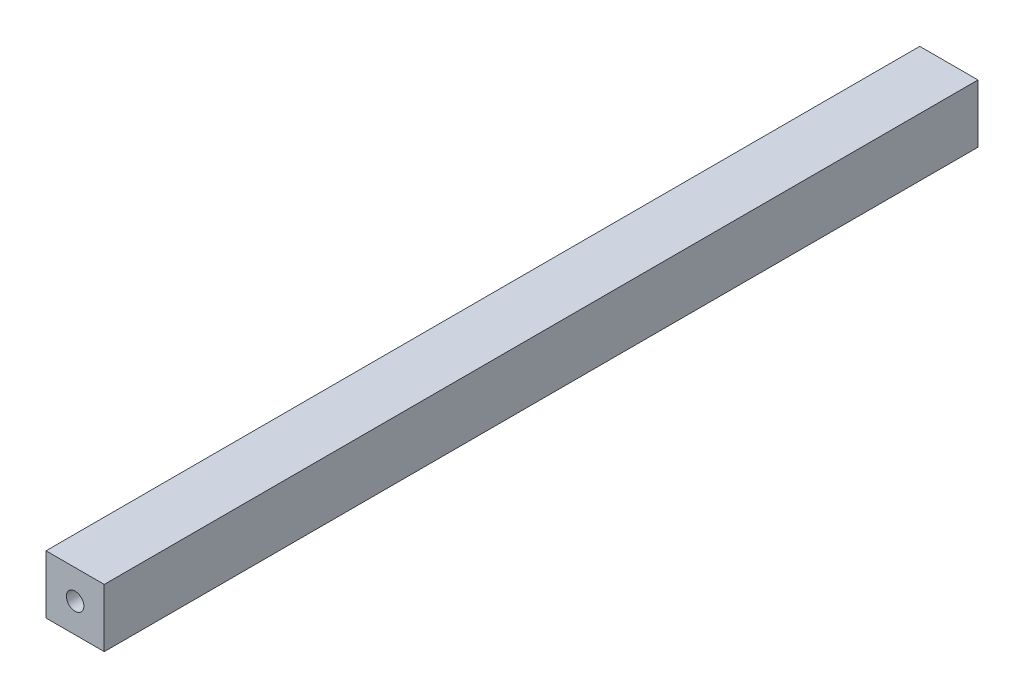
ISO-10303-21;
HEADER;
FILE_DESCRIPTION(('STEP AP214'),'2;1');
FILE_NAME('part.step','',(''),(''),'','','');
FILE_SCHEMA(('AUTOMOTIVE_DESIGN { 1 0 10303 214 1 1 1 1 }'));
ENDSEC;
DATA;
#1=APPLICATION_CONTEXT('core data for automotive mechanical design processes');
#2=APPLICATION_PROTOCOL_DEFINITION('international standard','automotive_design',2000,#1);
#3=PRODUCT_CONTEXT('',#1,'mechanical');
#4=PRODUCT('Part','Part','',(#3));
#5=PRODUCT_RELATED_PRODUCT_CATEGORY('part','',(#4));
#6=PRODUCT_DEFINITION_FORMATION('','',#4);
#7=PRODUCT_DEFINITION_CONTEXT('part definition',#1,'design');
#8=PRODUCT_DEFINITION('design','',#6,#7);
#9=PRODUCT_DEFINITION_SHAPE('','',#8);
#10=(LENGTH_UNIT() NAMED_UNIT(*) SI_UNIT(.MILLI.,.METRE.));
#11=(NAMED_UNIT(*) PLANE_ANGLE_UNIT() SI_UNIT($,.RADIAN.));
#12=(NAMED_UNIT(*) SI_UNIT($,.STERADIAN.) SOLID_ANGLE_UNIT());
#13=UNCERTAINTY_MEASURE_WITH_UNIT(LENGTH_MEASURE(1.E-05),#10,'distance_accuracy_value','');
#14=(GEOMETRIC_REPRESENTATION_CONTEXT(3) GLOBAL_UNCERTAINTY_ASSIGNED_CONTEXT((#13)) GLOBAL_UNIT_ASSIGNED_CONTEXT((#10,
#11,#12)) REPRESENTATION_CONTEXT('',''));
#15=CARTESIAN_POINT('',(0.,0.,0.));
#16=DIRECTION('',(0.,0.,1.));
#17=DIRECTION('',(1.,0.,0.));
#18=AXIS2_PLACEMENT_3D('',#15,#16,#17);
#19=CARTESIAN_POINT('',(-10.,10.,300.));
#20=DIRECTION('',(1.,0.,0.));
#21=DIRECTION('',(0.,0.,-1.));
#22=AXIS2_PLACEMENT_3D('',#19,#20,#21);
#23=PLANE('',#22);
#24=DIRECTION('',(0.,-1.,0.));
#25=VECTOR('',#24,1.);
#26=CARTESIAN_POINT('',(-10.,10.,0.));
#27=LINE('',#26,#25);
#28=CARTESIAN_POINT('',(-10.,10.,0.));
#29=VERTEX_POINT('',#28);
#30=CARTESIAN_POINT('',(-10.,-10.,0.));
#31=VERTEX_POINT('',#30);
#32=EDGE_CURVE('E106',#29,#31,#27,.T.);
#33=ORIENTED_EDGE('',*,*,#32,.T.);
#34=DIRECTION('',(0.,0.,-1.));
#35=VECTOR('',#34,1.);
#36=CARTESIAN_POINT('',(-10.,-10.,300.));
#37=LINE('',#36,#35);
#38=CARTESIAN_POINT('',(-10.,-10.,300.));
#39=VERTEX_POINT('',#38);
#40=EDGE_CURVE('E11',#39,#31,#37,.T.);
#41=ORIENTED_EDGE('',*,*,#40,.F.);
#42=DIRECTION('',(0.,-1.,0.));
#43=VECTOR('',#42,1.);
#44=CARTESIAN_POINT('',(-10.,10.,300.));
#45=LINE('',#44,#43);
#46=CARTESIAN_POINT('',(-10.,10.,300.));
#47=VERTEX_POINT('',#46);
#48=EDGE_CURVE('E90',#47,#39,#45,.T.);
#49=ORIENTED_EDGE('',*,*,#48,.F.);
#50=DIRECTION('',(0.,0.,-1.));
#51=VECTOR('',#50,1.);
#52=CARTESIAN_POINT('',(-10.,10.,300.));
#53=LINE('',#52,#51);
#54=EDGE_CURVE('E102',#47,#29,#53,.T.);
#55=ORIENTED_EDGE('',*,*,#54,.T.);
#56=EDGE_LOOP('',(#33,#41,#49,#55));
#57=FACE_BOUND('',#56,.T.);
#58=ADVANCED_FACE('F38',(#57),#23,.F.);
#59=CARTESIAN_POINT('',(-10.,-10.,300.));
#60=DIRECTION('',(0.,1.,0.));
#61=DIRECTION('',(-1.,0.,0.));
#62=AXIS2_PLACEMENT_3D('',#59,#60,#61);
#63=PLANE('',#62);
#64=DIRECTION('',(1.,0.,0.));
#65=VECTOR('',#64,1.);
#66=CARTESIAN_POINT('',(-10.,-10.,0.));
#67=LINE('',#66,#65);
#68=CARTESIAN_POINT('',(10.,-10.,0.));
#69=VERTEX_POINT('',#68);
#70=EDGE_CURVE('E95',#31,#69,#67,.T.);
#71=ORIENTED_EDGE('',*,*,#70,.T.);
#72=DIRECTION('',(0.,0.,-1.));
#73=VECTOR('',#72,1.);
#74=CARTESIAN_POINT('',(10.,-10.,300.));
#75=LINE('',#74,#73);
#76=CARTESIAN_POINT('',(10.,-10.,300.));
#77=VERTEX_POINT('',#76);
#78=EDGE_CURVE('E47',#77,#69,#75,.T.);
#79=ORIENTED_EDGE('',*,*,#78,.F.);
#80=DIRECTION('',(1.,0.,0.));
#81=VECTOR('',#80,1.);
#82=CARTESIAN_POINT('',(-10.,-10.,300.));
#83=LINE('',#82,#81);
#84=EDGE_CURVE('E85',#39,#77,#83,.T.);
#85=ORIENTED_EDGE('',*,*,#84,.F.);
#86=ORIENTED_EDGE('',*,*,#40,.T.);
#87=EDGE_LOOP('',(#71,#79,#85,#86));
#88=FACE_BOUND('',#87,.T.);
#89=ADVANCED_FACE('F94',(#88),#63,.F.);
#90=CARTESIAN_POINT('',(10.,10.,300.));
#91=DIRECTION('',(-1.,0.,0.));
#92=DIRECTION('',(0.,-1.,0.));
#93=AXIS2_PLACEMENT_3D('',#90,#91,#92);
#94=PLANE('',#93);
#95=DIRECTION('',(0.,1.,0.));
#96=VECTOR('',#95,1.);
#97=CARTESIAN_POINT('',(10.,10.,0.));
#98=LINE('',#97,#96);
#99=CARTESIAN_POINT('',(10.,10.,0.));
#100=VERTEX_POINT('',#99);
#101=EDGE_CURVE('E72',#69,#100,#98,.T.);
#102=ORIENTED_EDGE('',*,*,#101,.T.);
#103=DIRECTION('',(0.,0.,-1.));
#104=VECTOR('',#103,1.);
#105=CARTESIAN_POINT('',(10.,10.,300.));
#106=LINE('',#105,#104);
#107=CARTESIAN_POINT('',(10.,10.,300.));
#108=VERTEX_POINT('',#107);
#109=EDGE_CURVE('E97',#108,#100,#106,.T.);
#110=ORIENTED_EDGE('',*,*,#109,.F.);
#111=DIRECTION('',(0.,1.,0.));
#112=VECTOR('',#111,1.);
#113=CARTESIAN_POINT('',(10.,10.,300.));
#114=LINE('',#113,#112);
#115=EDGE_CURVE('E88',#77,#108,#114,.T.);
#116=ORIENTED_EDGE('',*,*,#115,.F.);
#117=ORIENTED_EDGE('',*,*,#78,.T.);
#118=EDGE_LOOP('',(#102,#110,#116,#117));
#119=FACE_BOUND('',#118,.T.);
#120=ADVANCED_FACE('F98',(#119),#94,.F.);
#121=CARTESIAN_POINT('',(-10.,10.,300.));
#122=DIRECTION('',(0.,-1.,0.));
#123=DIRECTION('',(1.,0.,0.));
#124=AXIS2_PLACEMENT_3D('',#121,#122,#123);
#125=PLANE('',#124);
#126=DIRECTION('',(-1.,0.,0.));
#127=VECTOR('',#126,1.);
#128=CARTESIAN_POINT('',(-10.,10.,0.));
#129=LINE('',#128,#127);
#130=EDGE_CURVE('E78',#100,#29,#129,.T.);
#131=ORIENTED_EDGE('',*,*,#130,.T.);
#132=ORIENTED_EDGE('',*,*,#54,.F.);
#133=DIRECTION('',(-1.,0.,0.));
#134=VECTOR('',#133,1.);
#135=CARTESIAN_POINT('',(-10.,10.,300.));
#136=LINE('',#135,#134);
#137=EDGE_CURVE('E55',#108,#47,#136,.T.);
#138=ORIENTED_EDGE('',*,*,#137,.F.);
#139=ORIENTED_EDGE('',*,*,#109,.T.);
#140=EDGE_LOOP('',(#131,#132,#138,#139));
#141=FACE_BOUND('',#140,.T.);
#142=ADVANCED_FACE('F120',(#141),#125,.F.);
#143=CARTESIAN_POINT('',(0.,0.,300.));
#144=DIRECTION('',(0.,0.,1.));
#145=DIRECTION('',(1.,0.,0.));
#146=AXIS2_PLACEMENT_3D('',#143,#144,#145);
#147=PLANE('',#146);
#148=CARTESIAN_POINT('',(0.,0.,300.));
#149=DIRECTION('',(0.,0.,1.));
#150=DIRECTION('',(1.,0.,0.));
#151=AXIS2_PLACEMENT_3D('',#148,#149,#150);
#152=CIRCLE('',#151,3.);
#153=CARTESIAN_POINT('',(3.,0.,300.));
#154=VERTEX_POINT('',#153);
#155=EDGE_CURVE('E110',#154,#154,#152,.T.);
#156=ORIENTED_EDGE('',*,*,#155,.F.);
#157=EDGE_LOOP('',(#156));
#158=FACE_BOUND('',#157,.T.);
#159=ORIENTED_EDGE('',*,*,#48,.T.);
#160=ORIENTED_EDGE('',*,*,#84,.T.);
#161=ORIENTED_EDGE('',*,*,#115,.T.);
#162=ORIENTED_EDGE('',*,*,#137,.T.);
#163=EDGE_LOOP('',(#159,#160,#161,#162));
#164=FACE_BOUND('',#163,.T.);
#165=ADVANCED_FACE('F86',(#158,#164),#147,.T.);
#166=CARTESIAN_POINT('',(0.,0.,0.));
#167=DIRECTION('',(0.,0.,1.));
#168=DIRECTION('',(1.,0.,0.));
#169=AXIS2_PLACEMENT_3D('',#166,#167,#168);
#170=PLANE('',#169);
#171=CARTESIAN_POINT('',(0.,0.,0.));
#172=DIRECTION('',(0.,0.,-1.));
#173=DIRECTION('',(-1.,0.,0.));
#174=AXIS2_PLACEMENT_3D('',#171,#172,#173);
#175=CIRCLE('',#174,3.);
#176=CARTESIAN_POINT('',(-3.,0.,0.));
#177=VERTEX_POINT('',#176);
#178=EDGE_CURVE('E130',#177,#177,#175,.T.);
#179=ORIENTED_EDGE('',*,*,#178,.F.);
#180=EDGE_LOOP('',(#179));
#181=FACE_BOUND('',#180,.T.);
#182=ORIENTED_EDGE('',*,*,#32,.F.);
#183=ORIENTED_EDGE('',*,*,#130,.F.);
#184=ORIENTED_EDGE('',*,*,#101,.F.);
#185=ORIENTED_EDGE('',*,*,#70,.F.);
#186=EDGE_LOOP('',(#182,#183,#184,#185));
#187=FACE_BOUND('',#186,.T.);
#188=ADVANCED_FACE('F123',(#181,#187),#170,.F.);
#189=CARTESIAN_POINT('',(0.,0.,100.));
#190=DIRECTION('',(0.,0.,1.));
#191=DIRECTION('',(1.,0.,0.));
#192=AXIS2_PLACEMENT_3D('',#189,#190,#191);
#193=CYLINDRICAL_SURFACE('',#192,3.);
#194=ORIENTED_EDGE('',*,*,#178,.T.);
#195=EDGE_LOOP('',(#194));
#196=FACE_BOUND('',#195,.T.);
#197=ORIENTED_EDGE('',*,*,#155,.T.);
#198=EDGE_LOOP('',(#197));
#199=FACE_BOUND('',#198,.T.);
#200=ADVANCED_FACE('F135',(#196,#199),#193,.F.);
#201=CLOSED_SHELL('',(#58,#89,#120,#142,#165,#188,#200));
#202=MANIFOLD_SOLID_BREP('B2',#201);
#203=ADVANCED_BREP_SHAPE_REPRESENTATION('',(#18,#202),#14);
#204=SHAPE_DEFINITION_REPRESENTATION(#9,#203);
ENDSEC;
END-ISO-10303-21;
